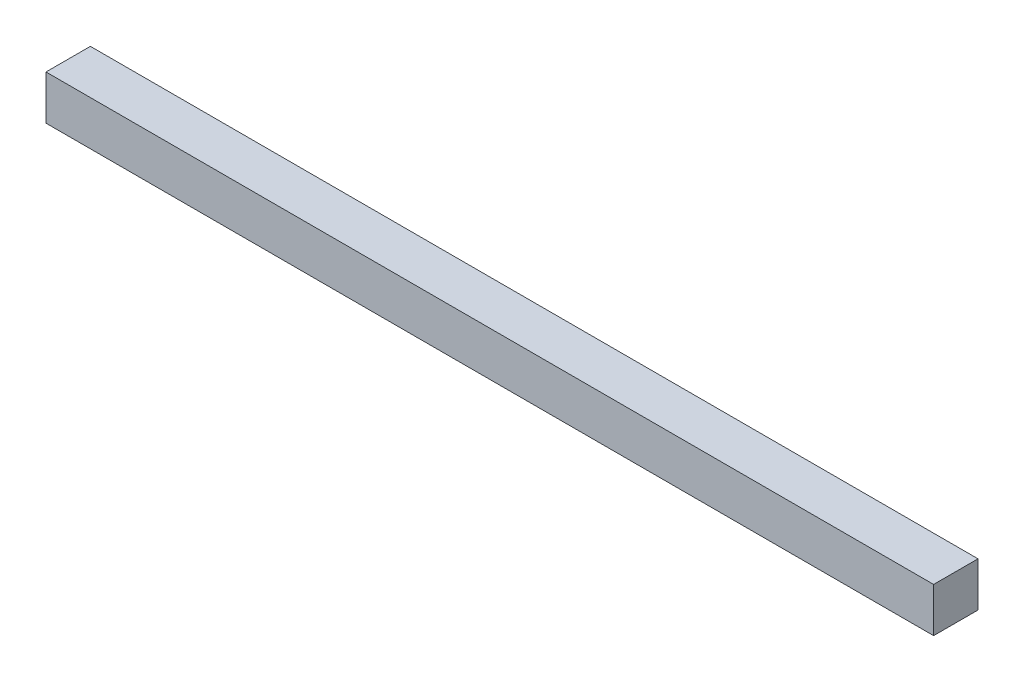
ISO-10303-21;
HEADER;
FILE_DESCRIPTION(('STEP AP214'),'2;1');
FILE_NAME('part.step','',(''),(''),'','','');
FILE_SCHEMA(('AUTOMOTIVE_DESIGN { 1 0 10303 214 1 1 1 1 }'));
ENDSEC;
DATA;
#1=APPLICATION_CONTEXT('core data for automotive mechanical design processes');
#2=APPLICATION_PROTOCOL_DEFINITION('international standard','automotive_design',2000,#1);
#3=PRODUCT_CONTEXT('',#1,'mechanical');
#4=PRODUCT('Part','Part','',(#3));
#5=PRODUCT_RELATED_PRODUCT_CATEGORY('part','',(#4));
#6=PRODUCT_DEFINITION_FORMATION('','',#4);
#7=PRODUCT_DEFINITION_CONTEXT('part definition',#1,'design');
#8=PRODUCT_DEFINITION('design','',#6,#7);
#9=PRODUCT_DEFINITION_SHAPE('','',#8);
#10=(LENGTH_UNIT() NAMED_UNIT(*) SI_UNIT(.MILLI.,.METRE.));
#11=(NAMED_UNIT(*) PLANE_ANGLE_UNIT() SI_UNIT($,.RADIAN.));
#12=(NAMED_UNIT(*) SI_UNIT($,.STERADIAN.) SOLID_ANGLE_UNIT());
#13=UNCERTAINTY_MEASURE_WITH_UNIT(LENGTH_MEASURE(1.E-05),#10,'distance_accuracy_value','');
#14=(GEOMETRIC_REPRESENTATION_CONTEXT(3) GLOBAL_UNCERTAINTY_ASSIGNED_CONTEXT((#13)) GLOBAL_UNIT_ASSIGNED_CONTEXT((#10,
#11,#12)) REPRESENTATION_CONTEXT('',''));
#15=CARTESIAN_POINT('',(0.,0.,0.));
#16=DIRECTION('',(0.,0.,1.));
#17=DIRECTION('',(1.,0.,0.));
#18=AXIS2_PLACEMENT_3D('',#15,#16,#17);
#19=CARTESIAN_POINT('',(508.,12.7,-12.7));
#20=DIRECTION('',(0.,0.,1.));
#21=DIRECTION('',(0.,-1.,0.));
#22=AXIS2_PLACEMENT_3D('',#19,#20,#21);
#23=PLANE('',#22);
#24=DIRECTION('',(0.,1.,0.));
#25=VECTOR('',#24,1.);
#26=CARTESIAN_POINT('',(0.,12.7,-12.7));
#27=LINE('',#26,#25);
#28=CARTESIAN_POINT('',(0.,-12.7,-12.7));
#29=VERTEX_POINT('',#28);
#30=CARTESIAN_POINT('',(0.,12.7,-12.7));
#31=VERTEX_POINT('',#30);
#32=EDGE_CURVE('E107',#29,#31,#27,.T.);
#33=ORIENTED_EDGE('',*,*,#32,.T.);
#34=DIRECTION('',(-1.,0.,0.));
#35=VECTOR('',#34,1.);
#36=CARTESIAN_POINT('',(508.,12.7,-12.7));
#37=LINE('',#36,#35);
#38=CARTESIAN_POINT('',(508.,12.7,-12.7));
#39=VERTEX_POINT('',#38);
#40=EDGE_CURVE('E11',#39,#31,#37,.T.);
#41=ORIENTED_EDGE('',*,*,#40,.F.);
#42=DIRECTION('',(0.,1.,0.));
#43=VECTOR('',#42,1.);
#44=CARTESIAN_POINT('',(508.,12.7,-12.7));
#45=LINE('',#44,#43);
#46=CARTESIAN_POINT('',(508.,-12.7,-12.7));
#47=VERTEX_POINT('',#46);
#48=EDGE_CURVE('E91',#47,#39,#45,.T.);
#49=ORIENTED_EDGE('',*,*,#48,.F.);
#50=DIRECTION('',(-1.,0.,0.));
#51=VECTOR('',#50,1.);
#52=CARTESIAN_POINT('',(508.,-12.7,-12.7));
#53=LINE('',#52,#51);
#54=EDGE_CURVE('E103',#47,#29,#53,.T.);
#55=ORIENTED_EDGE('',*,*,#54,.T.);
#56=EDGE_LOOP('',(#33,#41,#49,#55));
#57=FACE_BOUND('',#56,.T.);
#58=ADVANCED_FACE('F39',(#57),#23,.F.);
#59=CARTESIAN_POINT('',(508.,12.7,12.7));
#60=DIRECTION('',(0.,-1.,0.));
#61=DIRECTION('',(0.,0.,-1.));
#62=AXIS2_PLACEMENT_3D('',#59,#60,#61);
#63=PLANE('',#62);
#64=DIRECTION('',(0.,0.,1.));
#65=VECTOR('',#64,1.);
#66=CARTESIAN_POINT('',(0.,12.7,12.7));
#67=LINE('',#66,#65);
#68=CARTESIAN_POINT('',(0.,12.7,12.7));
#69=VERTEX_POINT('',#68);
#70=EDGE_CURVE('E96',#31,#69,#67,.T.);
#71=ORIENTED_EDGE('',*,*,#70,.T.);
#72=DIRECTION('',(-1.,0.,0.));
#73=VECTOR('',#72,1.);
#74=CARTESIAN_POINT('',(508.,12.7,12.7));
#75=LINE('',#74,#73);
#76=CARTESIAN_POINT('',(508.,12.7,12.7));
#77=VERTEX_POINT('',#76);
#78=EDGE_CURVE('E48',#77,#69,#75,.T.);
#79=ORIENTED_EDGE('',*,*,#78,.F.);
#80=DIRECTION('',(0.,0.,1.));
#81=VECTOR('',#80,1.);
#82=CARTESIAN_POINT('',(508.,12.7,12.7));
#83=LINE('',#82,#81);
#84=EDGE_CURVE('E86',#39,#77,#83,.T.);
#85=ORIENTED_EDGE('',*,*,#84,.F.);
#86=ORIENTED_EDGE('',*,*,#40,.T.);
#87=EDGE_LOOP('',(#71,#79,#85,#86));
#88=FACE_BOUND('',#87,.T.);
#89=ADVANCED_FACE('F95',(#88),#63,.F.);
#90=CARTESIAN_POINT('',(508.,12.7,12.7));
#91=DIRECTION('',(0.,0.,-1.));
#92=DIRECTION('',(0.,1.,0.));
#93=AXIS2_PLACEMENT_3D('',#90,#91,#92);
#94=PLANE('',#93);
#95=DIRECTION('',(0.,-1.,0.));
#96=VECTOR('',#95,1.);
#97=CARTESIAN_POINT('',(0.,12.7,12.7));
#98=LINE('',#97,#96);
#99=CARTESIAN_POINT('',(0.,-12.7,12.7));
#100=VERTEX_POINT('',#99);
#101=EDGE_CURVE('E73',#69,#100,#98,.T.);
#102=ORIENTED_EDGE('',*,*,#101,.T.);
#103=DIRECTION('',(-1.,0.,0.));
#104=VECTOR('',#103,1.);
#105=CARTESIAN_POINT('',(508.,-12.7,12.7));
#106=LINE('',#105,#104);
#107=CARTESIAN_POINT('',(508.,-12.7,12.7));
#108=VERTEX_POINT('',#107);
#109=EDGE_CURVE('E98',#108,#100,#106,.T.);
#110=ORIENTED_EDGE('',*,*,#109,.F.);
#111=DIRECTION('',(0.,-1.,0.));
#112=VECTOR('',#111,1.);
#113=CARTESIAN_POINT('',(508.,12.7,12.7));
#114=LINE('',#113,#112);
#115=EDGE_CURVE('E89',#77,#108,#114,.T.);
#116=ORIENTED_EDGE('',*,*,#115,.F.);
#117=ORIENTED_EDGE('',*,*,#78,.T.);
#118=EDGE_LOOP('',(#102,#110,#116,#117));
#119=FACE_BOUND('',#118,.T.);
#120=ADVANCED_FACE('F99',(#119),#94,.F.);
#121=CARTESIAN_POINT('',(508.,-12.7,12.7));
#122=DIRECTION('',(0.,1.,0.));
#123=DIRECTION('',(0.,0.,1.));
#124=AXIS2_PLACEMENT_3D('',#121,#122,#123);
#125=PLANE('',#124);
#126=DIRECTION('',(0.,0.,-1.));
#127=VECTOR('',#126,1.);
#128=CARTESIAN_POINT('',(0.,-12.7,12.7));
#129=LINE('',#128,#127);
#130=EDGE_CURVE('E79',#100,#29,#129,.T.);
#131=ORIENTED_EDGE('',*,*,#130,.T.);
#132=ORIENTED_EDGE('',*,*,#54,.F.);
#133=DIRECTION('',(0.,0.,-1.));
#134=VECTOR('',#133,1.);
#135=CARTESIAN_POINT('',(508.,-12.7,12.7));
#136=LINE('',#135,#134);
#137=EDGE_CURVE('E56',#108,#47,#136,.T.);
#138=ORIENTED_EDGE('',*,*,#137,.F.);
#139=ORIENTED_EDGE('',*,*,#109,.T.);
#140=EDGE_LOOP('',(#131,#132,#138,#139));
#141=FACE_BOUND('',#140,.T.);
#142=ADVANCED_FACE('F120',(#141),#125,.F.);
#143=CARTESIAN_POINT('',(508.,0.,0.));
#144=DIRECTION('',(1.,0.,0.));
#145=DIRECTION('',(0.,0.,-1.));
#146=AXIS2_PLACEMENT_3D('',#143,#144,#145);
#147=PLANE('',#146);
#148=ORIENTED_EDGE('',*,*,#48,.T.);
#149=ORIENTED_EDGE('',*,*,#84,.T.);
#150=ORIENTED_EDGE('',*,*,#115,.T.);
#151=ORIENTED_EDGE('',*,*,#137,.T.);
#152=EDGE_LOOP('',(#148,#149,#150,#151));
#153=FACE_BOUND('',#152,.T.);
#154=ADVANCED_FACE('F87',(#153),#147,.T.);
#155=CARTESIAN_POINT('',(0.,0.,0.));
#156=DIRECTION('',(1.,0.,0.));
#157=DIRECTION('',(0.,0.,-1.));
#158=AXIS2_PLACEMENT_3D('',#155,#156,#157);
#159=PLANE('',#158);
#160=ORIENTED_EDGE('',*,*,#32,.F.);
#161=ORIENTED_EDGE('',*,*,#130,.F.);
#162=ORIENTED_EDGE('',*,*,#101,.F.);
#163=ORIENTED_EDGE('',*,*,#70,.F.);
#164=EDGE_LOOP('',(#160,#161,#162,#163));
#165=FACE_BOUND('',#164,.T.);
#166=ADVANCED_FACE('F123',(#165),#159,.F.);
#167=CLOSED_SHELL('',(#58,#89,#120,#142,#154,#166));
#168=MANIFOLD_SOLID_BREP('B2',#167);
#169=ADVANCED_BREP_SHAPE_REPRESENTATION('',(#18,#168),#14);
#170=SHAPE_DEFINITION_REPRESENTATION(#9,#169);
ENDSEC;
END-ISO-10303-21;
